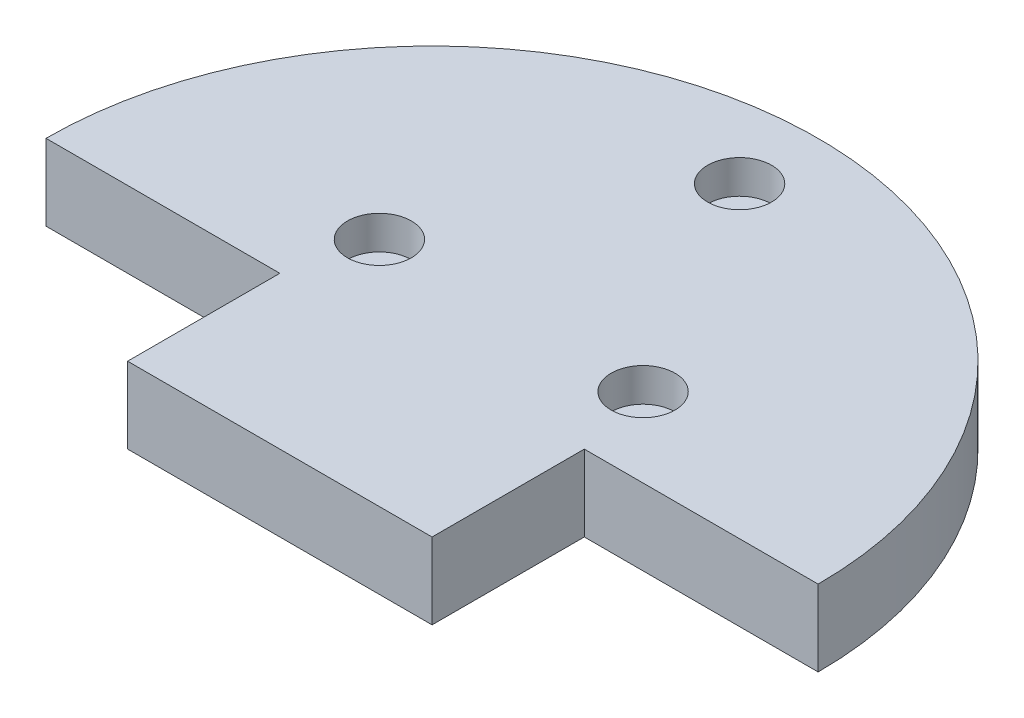
ISO-10303-21;
HEADER;
FILE_DESCRIPTION(('STEP AP214'),'2;1');
FILE_NAME('part.step','',(''),(''),'','','');
FILE_SCHEMA(('AUTOMOTIVE_DESIGN { 1 0 10303 214 1 1 1 1 }'));
ENDSEC;
DATA;
#1=APPLICATION_CONTEXT('core data for automotive mechanical design processes');
#2=APPLICATION_PROTOCOL_DEFINITION('international standard','automotive_design',2000,#1);
#3=PRODUCT_CONTEXT('',#1,'mechanical');
#4=PRODUCT('Part','Part','',(#3));
#5=PRODUCT_RELATED_PRODUCT_CATEGORY('part','',(#4));
#6=PRODUCT_DEFINITION_FORMATION('','',#4);
#7=PRODUCT_DEFINITION_CONTEXT('part definition',#1,'design');
#8=PRODUCT_DEFINITION('design','',#6,#7);
#9=PRODUCT_DEFINITION_SHAPE('','',#8);
#10=(LENGTH_UNIT() NAMED_UNIT(*) SI_UNIT(.MILLI.,.METRE.));
#11=(NAMED_UNIT(*) PLANE_ANGLE_UNIT() SI_UNIT($,.RADIAN.));
#12=(NAMED_UNIT(*) SI_UNIT($,.STERADIAN.) SOLID_ANGLE_UNIT());
#13=UNCERTAINTY_MEASURE_WITH_UNIT(LENGTH_MEASURE(1.E-05),#10,'distance_accuracy_value','');
#14=(GEOMETRIC_REPRESENTATION_CONTEXT(3) GLOBAL_UNCERTAINTY_ASSIGNED_CONTEXT((#13)) GLOBAL_UNIT_ASSIGNED_CONTEXT((#10,
#11,#12)) REPRESENTATION_CONTEXT('',''));
#15=CARTESIAN_POINT('',(0.,0.,0.));
#16=DIRECTION('',(0.,0.,1.));
#17=DIRECTION('',(1.,0.,0.));
#18=AXIS2_PLACEMENT_3D('',#15,#16,#17);
#19=CARTESIAN_POINT('',(-10.,5.,0.));
#20=DIRECTION('',(1.,0.,0.));
#21=DIRECTION('',(0.,0.,-1.));
#22=AXIS2_PLACEMENT_3D('',#19,#20,#21);
#23=PLANE('',#22);
#24=DIRECTION('',(0.,0.,1.));
#25=VECTOR('',#24,1.);
#26=CARTESIAN_POINT('',(-10.,0.,0.));
#27=LINE('',#26,#25);
#28=CARTESIAN_POINT('',(-10.,0.,-10.));
#29=VERTEX_POINT('',#28);
#30=CARTESIAN_POINT('',(-10.,0.,0.));
#31=VERTEX_POINT('',#30);
#32=EDGE_CURVE('E133',#29,#31,#27,.T.);
#33=ORIENTED_EDGE('',*,*,#32,.T.);
#34=DIRECTION('',(0.,-1.,0.));
#35=VECTOR('',#34,1.);
#36=CARTESIAN_POINT('',(-10.,5.,0.));
#37=LINE('',#36,#35);
#38=CARTESIAN_POINT('',(-10.,5.,0.));
#39=VERTEX_POINT('',#38);
#40=EDGE_CURVE('E11',#39,#31,#37,.T.);
#41=ORIENTED_EDGE('',*,*,#40,.F.);
#42=DIRECTION('',(0.,0.,1.));
#43=VECTOR('',#42,1.);
#44=CARTESIAN_POINT('',(-10.,5.,0.));
#45=LINE('',#44,#43);
#46=CARTESIAN_POINT('',(-10.,5.,-10.));
#47=VERTEX_POINT('',#46);
#48=EDGE_CURVE('E150',#47,#39,#45,.T.);
#49=ORIENTED_EDGE('',*,*,#48,.F.);
#50=DIRECTION('',(0.,-1.,0.));
#51=VECTOR('',#50,1.);
#52=CARTESIAN_POINT('',(-10.,5.,-10.));
#53=LINE('',#52,#51);
#54=EDGE_CURVE('E129',#47,#29,#53,.T.);
#55=ORIENTED_EDGE('',*,*,#54,.T.);
#56=EDGE_LOOP('',(#33,#41,#49,#55));
#57=FACE_BOUND('',#56,.T.);
#58=ADVANCED_FACE('F42',(#57),#23,.F.);
#59=CARTESIAN_POINT('',(-10.,5.,0.));
#60=DIRECTION('',(0.,0.,-1.));
#61=DIRECTION('',(-1.,0.,0.));
#62=AXIS2_PLACEMENT_3D('',#59,#60,#61);
#63=PLANE('',#62);
#64=DIRECTION('',(1.,0.,0.));
#65=VECTOR('',#64,1.);
#66=CARTESIAN_POINT('',(-10.,0.,0.));
#67=LINE('',#66,#65);
#68=CARTESIAN_POINT('',(10.,0.,0.));
#69=VERTEX_POINT('',#68);
#70=EDGE_CURVE('E137',#31,#69,#67,.T.);
#71=ORIENTED_EDGE('',*,*,#70,.T.);
#72=DIRECTION('',(0.,-1.,0.));
#73=VECTOR('',#72,1.);
#74=CARTESIAN_POINT('',(10.,5.,0.));
#75=LINE('',#74,#73);
#76=CARTESIAN_POINT('',(10.,5.,0.));
#77=VERTEX_POINT('',#76);
#78=EDGE_CURVE('E52',#77,#69,#75,.T.);
#79=ORIENTED_EDGE('',*,*,#78,.F.);
#80=DIRECTION('',(1.,0.,0.));
#81=VECTOR('',#80,1.);
#82=CARTESIAN_POINT('',(-10.,5.,0.));
#83=LINE('',#82,#81);
#84=EDGE_CURVE('E98',#39,#77,#83,.T.);
#85=ORIENTED_EDGE('',*,*,#84,.F.);
#86=ORIENTED_EDGE('',*,*,#40,.T.);
#87=EDGE_LOOP('',(#71,#79,#85,#86));
#88=FACE_BOUND('',#87,.T.);
#89=ADVANCED_FACE('F246',(#88),#63,.F.);
#90=CARTESIAN_POINT('',(10.,5.,0.));
#91=DIRECTION('',(-1.,0.,0.));
#92=DIRECTION('',(0.,0.,1.));
#93=AXIS2_PLACEMENT_3D('',#90,#91,#92);
#94=PLANE('',#93);
#95=DIRECTION('',(0.,0.,-1.));
#96=VECTOR('',#95,1.);
#97=CARTESIAN_POINT('',(10.,0.,0.));
#98=LINE('',#97,#96);
#99=CARTESIAN_POINT('',(10.,0.,-10.));
#100=VERTEX_POINT('',#99);
#101=EDGE_CURVE('E141',#69,#100,#98,.T.);
#102=ORIENTED_EDGE('',*,*,#101,.T.);
#103=DIRECTION('',(0.,-1.,0.));
#104=VECTOR('',#103,1.);
#105=CARTESIAN_POINT('',(10.,5.,-10.));
#106=LINE('',#105,#104);
#107=CARTESIAN_POINT('',(10.,5.,-10.));
#108=VERTEX_POINT('',#107);
#109=EDGE_CURVE('E122',#108,#100,#106,.T.);
#110=ORIENTED_EDGE('',*,*,#109,.F.);
#111=DIRECTION('',(0.,0.,-1.));
#112=VECTOR('',#111,1.);
#113=CARTESIAN_POINT('',(10.,5.,0.));
#114=LINE('',#113,#112);
#115=EDGE_CURVE('E111',#77,#108,#114,.T.);
#116=ORIENTED_EDGE('',*,*,#115,.F.);
#117=ORIENTED_EDGE('',*,*,#78,.T.);
#118=EDGE_LOOP('',(#102,#110,#116,#117));
#119=FACE_BOUND('',#118,.T.);
#120=ADVANCED_FACE('F251',(#119),#94,.F.);
#121=CARTESIAN_POINT('',(10.,5.,-10.));
#122=DIRECTION('',(0.,0.,-1.));
#123=DIRECTION('',(-1.,0.,0.));
#124=AXIS2_PLACEMENT_3D('',#121,#122,#123);
#125=PLANE('',#124);
#126=DIRECTION('',(1.,0.,0.));
#127=VECTOR('',#126,1.);
#128=CARTESIAN_POINT('',(10.,0.,-10.));
#129=LINE('',#128,#127);
#130=CARTESIAN_POINT('',(25.36,0.,-10.));
#131=VERTEX_POINT('',#130);
#132=EDGE_CURVE('E120',#100,#131,#129,.T.);
#133=ORIENTED_EDGE('',*,*,#132,.T.);
#134=DIRECTION('',(0.,-1.,0.));
#135=VECTOR('',#134,1.);
#136=CARTESIAN_POINT('',(25.36,5.,-10.));
#137=LINE('',#136,#135);
#138=CARTESIAN_POINT('',(25.36,5.,-10.));
#139=VERTEX_POINT('',#138);
#140=EDGE_CURVE('E117',#139,#131,#137,.T.);
#141=ORIENTED_EDGE('',*,*,#140,.F.);
#142=DIRECTION('',(1.,0.,0.));
#143=VECTOR('',#142,1.);
#144=CARTESIAN_POINT('',(10.,5.,-10.));
#145=LINE('',#144,#143);
#146=EDGE_CURVE('E105',#108,#139,#145,.T.);
#147=ORIENTED_EDGE('',*,*,#146,.F.);
#148=ORIENTED_EDGE('',*,*,#109,.T.);
#149=EDGE_LOOP('',(#133,#141,#147,#148));
#150=FACE_BOUND('',#149,.T.);
#151=ADVANCED_FACE('F118',(#150),#125,.F.);
#152=CARTESIAN_POINT('',(0.,5.,-10.));
#153=DIRECTION('',(0.,-1.,0.));
#154=DIRECTION('',(0.,0.,-1.));
#155=AXIS2_PLACEMENT_3D('',#152,#153,#154);
#156=CYLINDRICAL_SURFACE('',#155,25.36);
#157=CARTESIAN_POINT('',(0.,0.,-10.));
#158=DIRECTION('',(0.,1.,0.));
#159=DIRECTION('',(0.,0.,-1.));
#160=AXIS2_PLACEMENT_3D('',#157,#158,#159);
#161=CIRCLE('',#160,25.36);
#162=CARTESIAN_POINT('',(-25.36,0.,-9.99999999999999));
#163=VERTEX_POINT('',#162);
#164=EDGE_CURVE('E84',#131,#163,#161,.T.);
#165=ORIENTED_EDGE('',*,*,#164,.T.);
#166=DIRECTION('',(0.,-1.,0.));
#167=VECTOR('',#166,1.);
#168=CARTESIAN_POINT('',(-25.36,5.,-9.99999999999999));
#169=LINE('',#168,#167);
#170=CARTESIAN_POINT('',(-25.36,5.,-9.99999999999999));
#171=VERTEX_POINT('',#170);
#172=EDGE_CURVE('E123',#171,#163,#169,.T.);
#173=ORIENTED_EDGE('',*,*,#172,.F.);
#174=CARTESIAN_POINT('',(0.,5.,-10.));
#175=DIRECTION('',(0.,1.,0.));
#176=DIRECTION('',(0.,0.,-1.));
#177=AXIS2_PLACEMENT_3D('',#174,#175,#176);
#178=CIRCLE('',#177,25.36);
#179=EDGE_CURVE('E109',#139,#171,#178,.T.);
#180=ORIENTED_EDGE('',*,*,#179,.F.);
#181=ORIENTED_EDGE('',*,*,#140,.T.);
#182=EDGE_LOOP('',(#165,#173,#180,#181));
#183=FACE_BOUND('',#182,.T.);
#184=ADVANCED_FACE('F125',(#183),#156,.T.);
#185=CARTESIAN_POINT('',(-10.,5.,-10.));
#186=DIRECTION('',(0.,0.,-1.));
#187=DIRECTION('',(-1.,0.,0.));
#188=AXIS2_PLACEMENT_3D('',#185,#186,#187);
#189=PLANE('',#188);
#190=DIRECTION('',(1.,0.,0.));
#191=VECTOR('',#190,1.);
#192=CARTESIAN_POINT('',(-10.,0.,-10.));
#193=LINE('',#192,#191);
#194=EDGE_CURVE('E90',#163,#29,#193,.T.);
#195=ORIENTED_EDGE('',*,*,#194,.T.);
#196=ORIENTED_EDGE('',*,*,#54,.F.);
#197=DIRECTION('',(1.,0.,0.));
#198=VECTOR('',#197,1.);
#199=CARTESIAN_POINT('',(-10.,5.,-10.));
#200=LINE('',#199,#198);
#201=EDGE_CURVE('E61',#171,#47,#200,.T.);
#202=ORIENTED_EDGE('',*,*,#201,.F.);
#203=ORIENTED_EDGE('',*,*,#172,.T.);
#204=EDGE_LOOP('',(#195,#196,#202,#203));
#205=FACE_BOUND('',#204,.T.);
#206=ADVANCED_FACE('F231',(#205),#189,.F.);
#207=CARTESIAN_POINT('',(0.,5.,-10.));
#208=DIRECTION('',(0.,-1.,0.));
#209=DIRECTION('',(0.,0.,-1.));
#210=AXIS2_PLACEMENT_3D('',#207,#208,#209);
#211=PLANE('',#210);
#212=CARTESIAN_POINT('',(0.,5.,-30.2));
#213=DIRECTION('',(0.,1.,0.));
#214=DIRECTION('',(0.,0.,1.));
#215=AXIS2_PLACEMENT_3D('',#212,#213,#214);
#216=CIRCLE('',#215,2.1);
#217=CARTESIAN_POINT('',(0.,5.,-28.1));
#218=VERTEX_POINT('',#217);
#219=EDGE_CURVE('E187',#218,#218,#216,.T.);
#220=ORIENTED_EDGE('',*,*,#219,.F.);
#221=EDGE_LOOP('',(#220));
#222=FACE_BOUND('',#221,.T.);
#223=CARTESIAN_POINT('',(8.66,5.,-15.2));
#224=DIRECTION('',(0.,1.,0.));
#225=DIRECTION('',(0.,0.,1.));
#226=AXIS2_PLACEMENT_3D('',#223,#224,#225);
#227=CIRCLE('',#226,2.1);
#228=CARTESIAN_POINT('',(8.66,5.,-13.1));
#229=VERTEX_POINT('',#228);
#230=EDGE_CURVE('E191',#229,#229,#227,.T.);
#231=ORIENTED_EDGE('',*,*,#230,.F.);
#232=EDGE_LOOP('',(#231));
#233=FACE_BOUND('',#232,.T.);
#234=CARTESIAN_POINT('',(-8.66,5.,-15.2));
#235=DIRECTION('',(0.,1.,0.));
#236=DIRECTION('',(0.,0.,1.));
#237=AXIS2_PLACEMENT_3D('',#234,#235,#236);
#238=CIRCLE('',#237,2.1);
#239=CARTESIAN_POINT('',(-8.66,5.,-13.1));
#240=VERTEX_POINT('',#239);
#241=EDGE_CURVE('E199',#240,#240,#238,.T.);
#242=ORIENTED_EDGE('',*,*,#241,.F.);
#243=EDGE_LOOP('',(#242));
#244=FACE_BOUND('',#243,.T.);
#245=ORIENTED_EDGE('',*,*,#48,.T.);
#246=ORIENTED_EDGE('',*,*,#84,.T.);
#247=ORIENTED_EDGE('',*,*,#115,.T.);
#248=ORIENTED_EDGE('',*,*,#146,.T.);
#249=ORIENTED_EDGE('',*,*,#179,.T.);
#250=ORIENTED_EDGE('',*,*,#201,.T.);
#251=EDGE_LOOP('',(#245,#246,#247,#248,#249,#250));
#252=FACE_BOUND('',#251,.T.);
#253=ADVANCED_FACE('F107',(#222,#233,#244,#252),#211,.F.);
#254=CARTESIAN_POINT('',(0.,0.,-10.));
#255=DIRECTION('',(0.,-1.,0.));
#256=DIRECTION('',(0.,0.,-1.));
#257=AXIS2_PLACEMENT_3D('',#254,#255,#256);
#258=PLANE('',#257);
#259=CARTESIAN_POINT('',(-8.66,0.,-15.2));
#260=DIRECTION('',(0.,-1.,0.));
#261=DIRECTION('',(0.,0.,-1.));
#262=AXIS2_PLACEMENT_3D('',#259,#260,#261);
#263=CIRCLE('',#262,1.);
#264=CARTESIAN_POINT('',(-8.66,0.,-16.2));
#265=VERTEX_POINT('',#264);
#266=EDGE_CURVE('E179',#265,#265,#263,.T.);
#267=ORIENTED_EDGE('',*,*,#266,.F.);
#268=EDGE_LOOP('',(#267));
#269=FACE_BOUND('',#268,.T.);
#270=CARTESIAN_POINT('',(8.66,0.,-15.2));
#271=DIRECTION('',(0.,-1.,0.));
#272=DIRECTION('',(0.,0.,-1.));
#273=AXIS2_PLACEMENT_3D('',#270,#271,#272);
#274=CIRCLE('',#273,1.);
#275=CARTESIAN_POINT('',(8.66,0.,-16.2));
#276=VERTEX_POINT('',#275);
#277=EDGE_CURVE('E167',#276,#276,#274,.T.);
#278=ORIENTED_EDGE('',*,*,#277,.F.);
#279=EDGE_LOOP('',(#278));
#280=FACE_BOUND('',#279,.T.);
#281=CARTESIAN_POINT('',(0.,0.,-30.2));
#282=DIRECTION('',(0.,-1.,0.));
#283=DIRECTION('',(0.,0.,-1.));
#284=AXIS2_PLACEMENT_3D('',#281,#282,#283);
#285=CIRCLE('',#284,1.);
#286=CARTESIAN_POINT('',(0.,0.,-31.2));
#287=VERTEX_POINT('',#286);
#288=EDGE_CURVE('E163',#287,#287,#285,.T.);
#289=ORIENTED_EDGE('',*,*,#288,.F.);
#290=EDGE_LOOP('',(#289));
#291=FACE_BOUND('',#290,.T.);
#292=ORIENTED_EDGE('',*,*,#32,.F.);
#293=ORIENTED_EDGE('',*,*,#194,.F.);
#294=ORIENTED_EDGE('',*,*,#164,.F.);
#295=ORIENTED_EDGE('',*,*,#132,.F.);
#296=ORIENTED_EDGE('',*,*,#101,.F.);
#297=ORIENTED_EDGE('',*,*,#70,.F.);
#298=EDGE_LOOP('',(#292,#293,#294,#295,#296,#297));
#299=FACE_BOUND('',#298,.T.);
#300=ADVANCED_FACE('F226',(#269,#280,#291,#299),#258,.T.);
#301=CARTESIAN_POINT('',(-8.66,2.8,-15.2));
#302=DIRECTION('',(0.,1.,0.));
#303=DIRECTION('',(0.,0.,1.));
#304=AXIS2_PLACEMENT_3D('',#301,#302,#303);
#305=CYLINDRICAL_SURFACE('',#304,2.1);
#306=CARTESIAN_POINT('',(-8.66,2.8,-15.2));
#307=DIRECTION('',(0.,1.,0.));
#308=DIRECTION('',(0.,0.,1.));
#309=AXIS2_PLACEMENT_3D('',#306,#307,#308);
#310=CIRCLE('',#309,2.1);
#311=CARTESIAN_POINT('',(-8.66,2.8,-13.1));
#312=VERTEX_POINT('',#311);
#313=EDGE_CURVE('E183',#312,#312,#310,.T.);
#314=ORIENTED_EDGE('',*,*,#313,.F.);
#315=EDGE_LOOP('',(#314));
#316=FACE_BOUND('',#315,.T.);
#317=ORIENTED_EDGE('',*,*,#241,.T.);
#318=EDGE_LOOP('',(#317));
#319=FACE_BOUND('',#318,.T.);
#320=ADVANCED_FACE('F220',(#316,#319),#305,.F.);
#321=CARTESIAN_POINT('',(-8.66,2.8,-15.2));
#322=DIRECTION('',(0.,1.,0.));
#323=DIRECTION('',(0.,0.,1.));
#324=AXIS2_PLACEMENT_3D('',#321,#322,#323);
#325=PLANE('',#324);
#326=CARTESIAN_POINT('',(-8.66,2.8,-15.2));
#327=DIRECTION('',(0.,1.,0.));
#328=DIRECTION('',(0.,0.,1.));
#329=AXIS2_PLACEMENT_3D('',#326,#327,#328);
#330=CIRCLE('',#329,1.);
#331=CARTESIAN_POINT('',(-8.66,2.8,-14.2));
#332=VERTEX_POINT('',#331);
#333=EDGE_CURVE('E45',#332,#332,#330,.T.);
#334=ORIENTED_EDGE('',*,*,#333,.F.);
#335=EDGE_LOOP('',(#334));
#336=FACE_BOUND('',#335,.T.);
#337=ORIENTED_EDGE('',*,*,#313,.T.);
#338=EDGE_LOOP('',(#337));
#339=FACE_BOUND('',#338,.T.);
#340=ADVANCED_FACE('F216',(#336,#339),#325,.T.);
#341=CARTESIAN_POINT('',(8.66,2.8,-15.2));
#342=DIRECTION('',(0.,1.,0.));
#343=DIRECTION('',(0.,0.,1.));
#344=AXIS2_PLACEMENT_3D('',#341,#342,#343);
#345=CYLINDRICAL_SURFACE('',#344,2.1);
#346=CARTESIAN_POINT('',(8.66,2.8,-15.2));
#347=DIRECTION('',(0.,1.,0.));
#348=DIRECTION('',(0.,0.,1.));
#349=AXIS2_PLACEMENT_3D('',#346,#347,#348);
#350=CIRCLE('',#349,2.1);
#351=CARTESIAN_POINT('',(8.66,2.8,-13.1));
#352=VERTEX_POINT('',#351);
#353=EDGE_CURVE('E195',#352,#352,#350,.T.);
#354=ORIENTED_EDGE('',*,*,#353,.F.);
#355=EDGE_LOOP('',(#354));
#356=FACE_BOUND('',#355,.T.);
#357=ORIENTED_EDGE('',*,*,#230,.T.);
#358=EDGE_LOOP('',(#357));
#359=FACE_BOUND('',#358,.T.);
#360=ADVANCED_FACE('F219',(#356,#359),#345,.F.);
#361=CARTESIAN_POINT('',(8.66,2.8,-15.2));
#362=DIRECTION('',(0.,1.,0.));
#363=DIRECTION('',(0.,0.,1.));
#364=AXIS2_PLACEMENT_3D('',#361,#362,#363);
#365=PLANE('',#364);
#366=CARTESIAN_POINT('',(8.66,2.8,-15.2));
#367=DIRECTION('',(0.,1.,0.));
#368=DIRECTION('',(0.,0.,1.));
#369=AXIS2_PLACEMENT_3D('',#366,#367,#368);
#370=CIRCLE('',#369,1.);
#371=CARTESIAN_POINT('',(8.66,2.8,-14.2));
#372=VERTEX_POINT('',#371);
#373=EDGE_CURVE('E164',#372,#372,#370,.T.);
#374=ORIENTED_EDGE('',*,*,#373,.F.);
#375=EDGE_LOOP('',(#374));
#376=FACE_BOUND('',#375,.T.);
#377=ORIENTED_EDGE('',*,*,#353,.T.);
#378=EDGE_LOOP('',(#377));
#379=FACE_BOUND('',#378,.T.);
#380=ADVANCED_FACE('F304',(#376,#379),#365,.T.);
#381=CARTESIAN_POINT('',(0.,2.8,-30.2));
#382=DIRECTION('',(0.,1.,0.));
#383=DIRECTION('',(0.,0.,1.));
#384=AXIS2_PLACEMENT_3D('',#381,#382,#383);
#385=CYLINDRICAL_SURFACE('',#384,2.1);
#386=CARTESIAN_POINT('',(0.,2.8,-30.2));
#387=DIRECTION('',(0.,1.,0.));
#388=DIRECTION('',(0.,0.,1.));
#389=AXIS2_PLACEMENT_3D('',#386,#387,#388);
#390=CIRCLE('',#389,2.1);
#391=CARTESIAN_POINT('',(0.,2.8,-28.1));
#392=VERTEX_POINT('',#391);
#393=EDGE_CURVE('E138',#392,#392,#390,.T.);
#394=ORIENTED_EDGE('',*,*,#393,.F.);
#395=EDGE_LOOP('',(#394));
#396=FACE_BOUND('',#395,.T.);
#397=ORIENTED_EDGE('',*,*,#219,.T.);
#398=EDGE_LOOP('',(#397));
#399=FACE_BOUND('',#398,.T.);
#400=ADVANCED_FACE('F311',(#396,#399),#385,.F.);
#401=CARTESIAN_POINT('',(0.,2.8,-30.2));
#402=DIRECTION('',(0.,1.,0.));
#403=DIRECTION('',(0.,0.,1.));
#404=AXIS2_PLACEMENT_3D('',#401,#402,#403);
#405=PLANE('',#404);
#406=CARTESIAN_POINT('',(0.,2.8,-30.2));
#407=DIRECTION('',(0.,1.,0.));
#408=DIRECTION('',(0.,0.,1.));
#409=AXIS2_PLACEMENT_3D('',#406,#407,#408);
#410=CIRCLE('',#409,1.);
#411=CARTESIAN_POINT('',(0.,2.8,-29.2));
#412=VERTEX_POINT('',#411);
#413=EDGE_CURVE('E160',#412,#412,#410,.T.);
#414=ORIENTED_EDGE('',*,*,#413,.F.);
#415=EDGE_LOOP('',(#414));
#416=FACE_BOUND('',#415,.T.);
#417=ORIENTED_EDGE('',*,*,#393,.T.);
#418=EDGE_LOOP('',(#417));
#419=FACE_BOUND('',#418,.T.);
#420=ADVANCED_FACE('F322',(#416,#419),#405,.T.);
#421=CARTESIAN_POINT('',(0.,-5.,-30.2));
#422=DIRECTION('',(0.,1.,0.));
#423=DIRECTION('',(0.,0.,1.));
#424=AXIS2_PLACEMENT_3D('',#421,#422,#423);
#425=CYLINDRICAL_SURFACE('',#424,1.);
#426=ORIENTED_EDGE('',*,*,#288,.T.);
#427=EDGE_LOOP('',(#426));
#428=FACE_BOUND('',#427,.T.);
#429=ORIENTED_EDGE('',*,*,#413,.T.);
#430=EDGE_LOOP('',(#429));
#431=FACE_BOUND('',#430,.T.);
#432=ADVANCED_FACE('F329',(#428,#431),#425,.F.);
#433=CARTESIAN_POINT('',(8.66,-5.,-15.2));
#434=DIRECTION('',(0.,1.,0.));
#435=DIRECTION('',(0.,0.,1.));
#436=AXIS2_PLACEMENT_3D('',#433,#434,#435);
#437=CYLINDRICAL_SURFACE('',#436,1.);
#438=ORIENTED_EDGE('',*,*,#277,.T.);
#439=EDGE_LOOP('',(#438));
#440=FACE_BOUND('',#439,.T.);
#441=ORIENTED_EDGE('',*,*,#373,.T.);
#442=EDGE_LOOP('',(#441));
#443=FACE_BOUND('',#442,.T.);
#444=ADVANCED_FACE('F340',(#440,#443),#437,.F.);
#445=CARTESIAN_POINT('',(-8.66,-5.,-15.2));
#446=DIRECTION('',(0.,1.,0.));
#447=DIRECTION('',(0.,0.,1.));
#448=AXIS2_PLACEMENT_3D('',#445,#446,#447);
#449=CYLINDRICAL_SURFACE('',#448,1.);
#450=ORIENTED_EDGE('',*,*,#266,.T.);
#451=EDGE_LOOP('',(#450));
#452=FACE_BOUND('',#451,.T.);
#453=ORIENTED_EDGE('',*,*,#333,.T.);
#454=EDGE_LOOP('',(#453));
#455=FACE_BOUND('',#454,.T.);
#456=ADVANCED_FACE('F214',(#452,#455),#449,.F.);
#457=CLOSED_SHELL('',(#58,#89,#120,#151,#184,#206,#253,#300,#320,#340,#360,#380,#400,#420,#432,
#444,#456));
#458=MANIFOLD_SOLID_BREP('B2',#457);
#459=ADVANCED_BREP_SHAPE_REPRESENTATION('',(#18,#458),#14);
#460=SHAPE_DEFINITION_REPRESENTATION(#9,#459);
ENDSEC;
END-ISO-10303-21;
